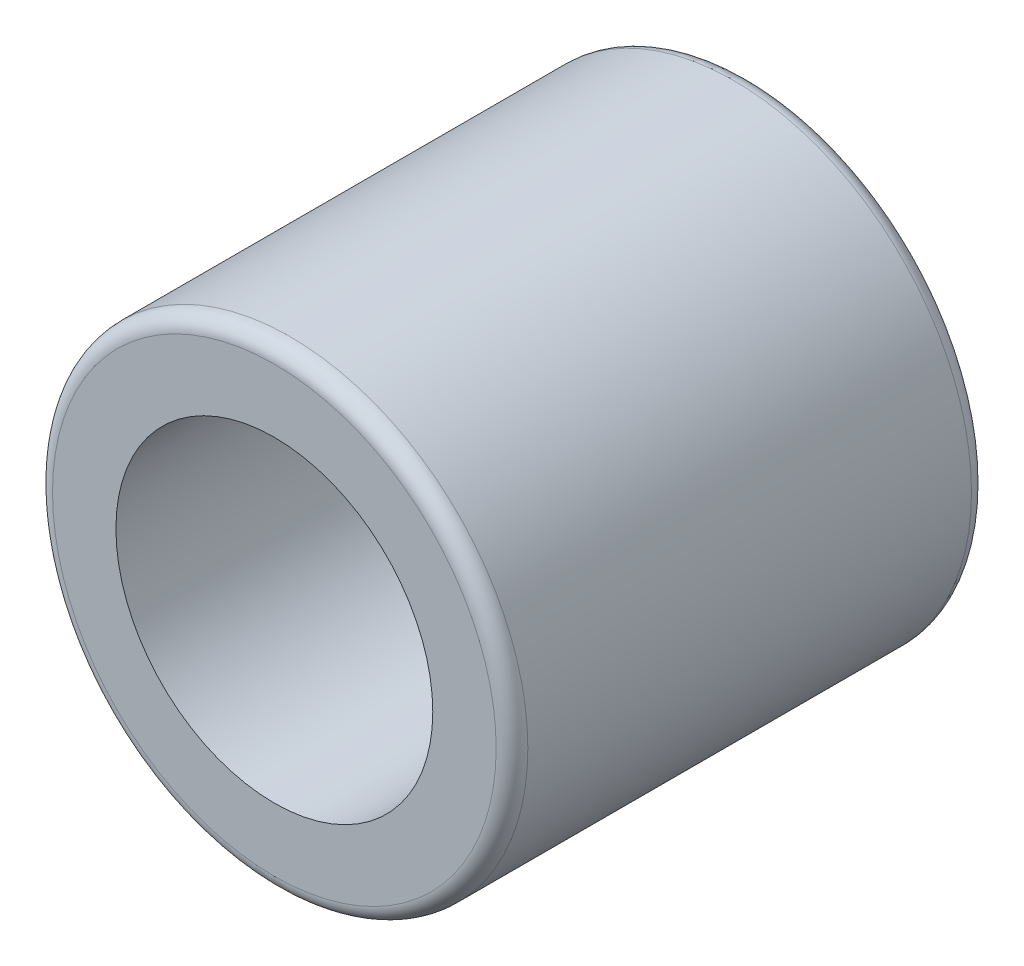
ISO-10303-21;
HEADER;
FILE_DESCRIPTION(('STEP AP214'),'2;1');
FILE_NAME('part.step','',(''),(''),'','','');
FILE_SCHEMA(('AUTOMOTIVE_DESIGN { 1 0 10303 214 1 1 1 1 }'));
ENDSEC;
DATA;
#1=APPLICATION_CONTEXT('core data for automotive mechanical design processes');
#2=APPLICATION_PROTOCOL_DEFINITION('international standard','automotive_design',2000,#1);
#3=PRODUCT_CONTEXT('',#1,'mechanical');
#4=PRODUCT('Part','Part','',(#3));
#5=PRODUCT_RELATED_PRODUCT_CATEGORY('part','',(#4));
#6=PRODUCT_DEFINITION_FORMATION('','',#4);
#7=PRODUCT_DEFINITION_CONTEXT('part definition',#1,'design');
#8=PRODUCT_DEFINITION('design','',#6,#7);
#9=PRODUCT_DEFINITION_SHAPE('','',#8);
#10=(LENGTH_UNIT() NAMED_UNIT(*) SI_UNIT(.MILLI.,.METRE.));
#11=(NAMED_UNIT(*) PLANE_ANGLE_UNIT() SI_UNIT($,.RADIAN.));
#12=(NAMED_UNIT(*) SI_UNIT($,.STERADIAN.) SOLID_ANGLE_UNIT());
#13=UNCERTAINTY_MEASURE_WITH_UNIT(LENGTH_MEASURE(1.E-05),#10,'distance_accuracy_value','');
#14=(GEOMETRIC_REPRESENTATION_CONTEXT(3) GLOBAL_UNCERTAINTY_ASSIGNED_CONTEXT((#13)) GLOBAL_UNIT_ASSIGNED_CONTEXT((#10,
#11,#12)) REPRESENTATION_CONTEXT('',''));
#15=CARTESIAN_POINT('',(0.,0.,0.));
#16=DIRECTION('',(0.,0.,1.));
#17=DIRECTION('',(1.,0.,0.));
#18=AXIS2_PLACEMENT_3D('',#15,#16,#17);
#19=CARTESIAN_POINT('',(0.,0.,30.));
#20=DIRECTION('',(0.,0.,1.));
#21=DIRECTION('',(1.,0.,0.));
#22=AXIS2_PLACEMENT_3D('',#19,#20,#21);
#23=PLANE('',#22);
#24=CARTESIAN_POINT('',(0.,0.,30.));
#25=DIRECTION('',(0.,0.,1.));
#26=DIRECTION('',(1.,0.,0.));
#27=AXIS2_PLACEMENT_3D('',#24,#25,#26);
#28=CIRCLE('',#27,14.);
#29=CARTESIAN_POINT('',(14.,0.,30.));
#30=VERTEX_POINT('',#29);
#31=EDGE_CURVE('E57',#30,#30,#28,.T.);
#32=ORIENTED_EDGE('',*,*,#31,.T.);
#33=EDGE_LOOP('',(#32));
#34=FACE_BOUND('',#33,.T.);
#35=CARTESIAN_POINT('',(0.,0.,30.));
#36=DIRECTION('',(0.,0.,1.));
#37=DIRECTION('',(1.,0.,0.));
#38=AXIS2_PLACEMENT_3D('',#35,#36,#37);
#39=CIRCLE('',#38,10.);
#40=CARTESIAN_POINT('',(10.,0.,30.));
#41=VERTEX_POINT('',#40);
#42=EDGE_CURVE('E63',#41,#41,#39,.T.);
#43=ORIENTED_EDGE('',*,*,#42,.F.);
#44=EDGE_LOOP('',(#43));
#45=FACE_BOUND('',#44,.T.);
#46=ADVANCED_FACE('F39',(#34,#45),#23,.T.);
#47=CARTESIAN_POINT('',(0.,0.,0.));
#48=DIRECTION('',(0.,0.,1.));
#49=DIRECTION('',(1.,0.,0.));
#50=AXIS2_PLACEMENT_3D('',#47,#48,#49);
#51=PLANE('',#50);
#52=CARTESIAN_POINT('',(0.,0.,0.));
#53=DIRECTION('',(0.,0.,1.));
#54=DIRECTION('',(1.,0.,0.));
#55=AXIS2_PLACEMENT_3D('',#52,#53,#54);
#56=CIRCLE('',#55,14.);
#57=CARTESIAN_POINT('',(14.,0.,0.));
#58=VERTEX_POINT('',#57);
#59=EDGE_CURVE('E10',#58,#58,#56,.F.);
#60=ORIENTED_EDGE('',*,*,#59,.T.);
#61=EDGE_LOOP('',(#60));
#62=FACE_BOUND('',#61,.T.);
#63=CARTESIAN_POINT('',(0.,0.,0.));
#64=DIRECTION('',(0.,0.,1.));
#65=DIRECTION('',(1.,0.,0.));
#66=AXIS2_PLACEMENT_3D('',#63,#64,#65);
#67=CIRCLE('',#66,10.);
#68=CARTESIAN_POINT('',(10.,0.,0.));
#69=VERTEX_POINT('',#68);
#70=EDGE_CURVE('E64',#69,#69,#67,.T.);
#71=ORIENTED_EDGE('',*,*,#70,.T.);
#72=EDGE_LOOP('',(#71));
#73=FACE_BOUND('',#72,.T.);
#74=ADVANCED_FACE('F76',(#62,#73),#51,.F.);
#75=CARTESIAN_POINT('',(0.,0.,30.));
#76=DIRECTION('',(0.,0.,-1.));
#77=DIRECTION('',(-1.,0.,0.));
#78=AXIS2_PLACEMENT_3D('',#75,#76,#77);
#79=CYLINDRICAL_SURFACE('',#78,15.);
#80=CARTESIAN_POINT('',(0.,0.,29.));
#81=DIRECTION('',(0.,0.,1.));
#82=DIRECTION('',(1.,0.,0.));
#83=AXIS2_PLACEMENT_3D('',#80,#81,#82);
#84=CIRCLE('',#83,15.);
#85=CARTESIAN_POINT('',(15.,0.,29.));
#86=VERTEX_POINT('',#85);
#87=EDGE_CURVE('E47',#86,#86,#84,.F.);
#88=ORIENTED_EDGE('',*,*,#87,.T.);
#89=EDGE_LOOP('',(#88));
#90=FACE_BOUND('',#89,.T.);
#91=CARTESIAN_POINT('',(0.,0.,1.));
#92=DIRECTION('',(0.,0.,1.));
#93=DIRECTION('',(1.,0.,0.));
#94=AXIS2_PLACEMENT_3D('',#91,#92,#93);
#95=CIRCLE('',#94,15.);
#96=CARTESIAN_POINT('',(15.,0.,1.));
#97=VERTEX_POINT('',#96);
#98=EDGE_CURVE('E52',#97,#97,#95,.T.);
#99=ORIENTED_EDGE('',*,*,#98,.T.);
#100=EDGE_LOOP('',(#99));
#101=FACE_BOUND('',#100,.T.);
#102=ADVANCED_FACE('F82',(#90,#101),#79,.T.);
#103=CARTESIAN_POINT('',(0.,0.,30.));
#104=DIRECTION('',(0.,0.,-1.));
#105=DIRECTION('',(-1.,0.,0.));
#106=AXIS2_PLACEMENT_3D('',#103,#104,#105);
#107=CYLINDRICAL_SURFACE('',#106,10.);
#108=ORIENTED_EDGE('',*,*,#42,.T.);
#109=EDGE_LOOP('',(#108));
#110=FACE_BOUND('',#109,.T.);
#111=ORIENTED_EDGE('',*,*,#70,.F.);
#112=EDGE_LOOP('',(#111));
#113=FACE_BOUND('',#112,.T.);
#114=ADVANCED_FACE('F72',(#110,#113),#107,.F.);
#115=CARTESIAN_POINT('',(0.,0.,29.));
#116=DIRECTION('',(0.,0.,1.));
#117=DIRECTION('',(1.,0.,0.));
#118=AXIS2_PLACEMENT_3D('',#115,#116,#117);
#119=TOROIDAL_SURFACE('',#118,14.,1.);
#120=ORIENTED_EDGE('',*,*,#87,.F.);
#121=EDGE_LOOP('',(#120));
#122=FACE_BOUND('',#121,.T.);
#123=ORIENTED_EDGE('',*,*,#31,.F.);
#124=EDGE_LOOP('',(#123));
#125=FACE_BOUND('',#124,.T.);
#126=ADVANCED_FACE('F87',(#122,#125),#119,.T.);
#127=CARTESIAN_POINT('',(0.,0.,1.));
#128=DIRECTION('',(0.,0.,1.));
#129=DIRECTION('',(1.,0.,0.));
#130=AXIS2_PLACEMENT_3D('',#127,#128,#129);
#131=TOROIDAL_SURFACE('',#130,14.,1.);
#132=ORIENTED_EDGE('',*,*,#59,.F.);
#133=EDGE_LOOP('',(#132));
#134=FACE_BOUND('',#133,.T.);
#135=ORIENTED_EDGE('',*,*,#98,.F.);
#136=EDGE_LOOP('',(#135));
#137=FACE_BOUND('',#136,.T.);
#138=ADVANCED_FACE('F41',(#134,#137),#131,.T.);
#139=CLOSED_SHELL('',(#46,#74,#102,#114,#126,#138));
#140=MANIFOLD_SOLID_BREP('B2',#139);
#141=ADVANCED_BREP_SHAPE_REPRESENTATION('',(#18,#140),#14);
#142=SHAPE_DEFINITION_REPRESENTATION(#9,#141);
ENDSEC;
END-ISO-10303-21;
